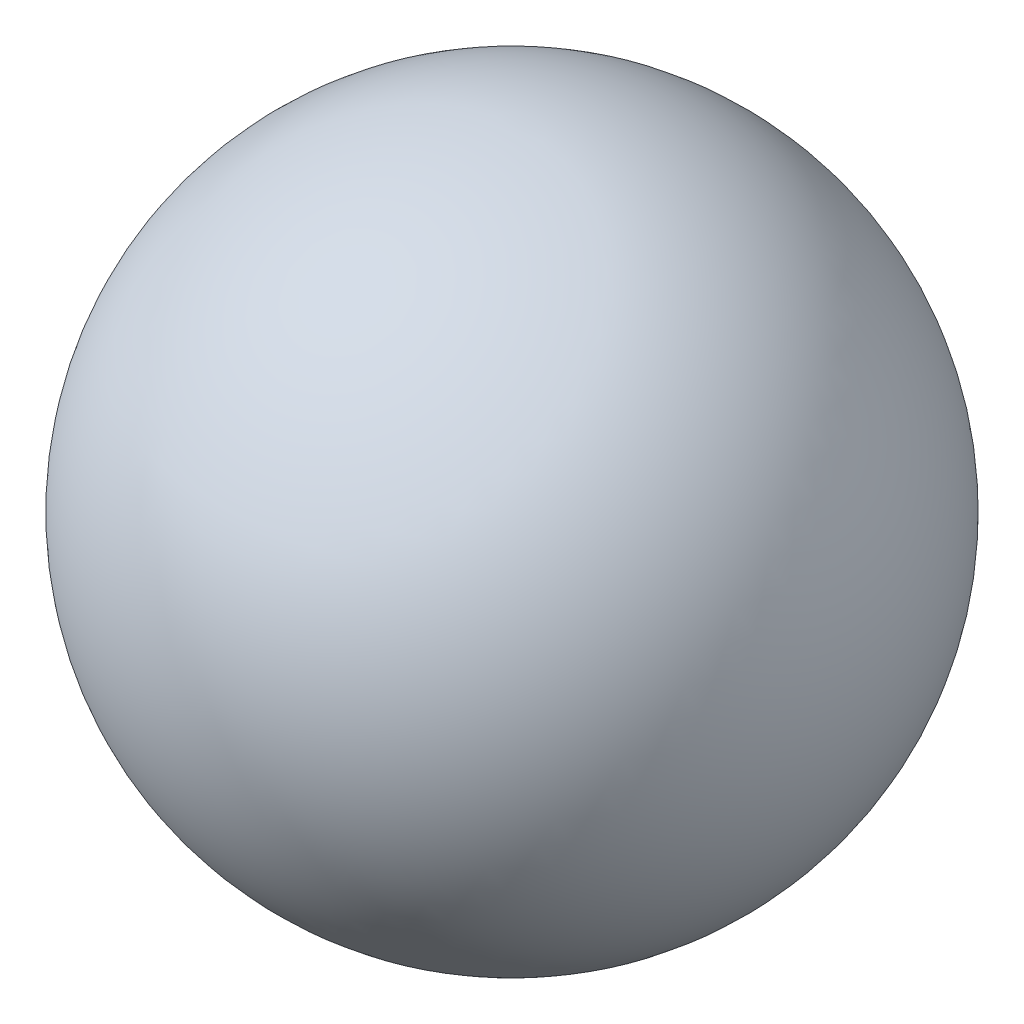
ISO-10303-21;
HEADER;
FILE_DESCRIPTION(('STEP AP214'),'2;1');
FILE_NAME('part.step','',(''),(''),'','','');
FILE_SCHEMA(('AUTOMOTIVE_DESIGN { 1 0 10303 214 1 1 1 1 }'));
ENDSEC;
DATA;
#1=APPLICATION_CONTEXT('core data for automotive mechanical design processes');
#2=APPLICATION_PROTOCOL_DEFINITION('international standard','automotive_design',2000,#1);
#3=PRODUCT_CONTEXT('',#1,'mechanical');
#4=PRODUCT('Part','Part','',(#3));
#5=PRODUCT_RELATED_PRODUCT_CATEGORY('part','',(#4));
#6=PRODUCT_DEFINITION_FORMATION('','',#4);
#7=PRODUCT_DEFINITION_CONTEXT('part definition',#1,'design');
#8=PRODUCT_DEFINITION('design','',#6,#7);
#9=PRODUCT_DEFINITION_SHAPE('','',#8);
#10=(LENGTH_UNIT() NAMED_UNIT(*) SI_UNIT(.MILLI.,.METRE.));
#11=(NAMED_UNIT(*) PLANE_ANGLE_UNIT() SI_UNIT($,.RADIAN.));
#12=(NAMED_UNIT(*) SI_UNIT($,.STERADIAN.) SOLID_ANGLE_UNIT());
#13=UNCERTAINTY_MEASURE_WITH_UNIT(LENGTH_MEASURE(1.E-05),#10,'distance_accuracy_value','');
#14=(GEOMETRIC_REPRESENTATION_CONTEXT(3) GLOBAL_UNCERTAINTY_ASSIGNED_CONTEXT((#13)) GLOBAL_UNIT_ASSIGNED_CONTEXT((#10,
#11,#12)) REPRESENTATION_CONTEXT('',''));
#15=CARTESIAN_POINT('',(0.,0.,0.));
#16=DIRECTION('',(0.,0.,1.));
#17=DIRECTION('',(1.,0.,0.));
#18=AXIS2_PLACEMENT_3D('',#15,#16,#17);
#19=CARTESIAN_POINT('',(0.,21.38,0.));
#20=DIRECTION('',(0.,-1.,0.));
#21=DIRECTION('',(-1.,0.,0.));
#22=AXIS2_PLACEMENT_3D('',#19,#20,#21);
#23=SPHERICAL_SURFACE('',#22,21.38);
#24=CARTESIAN_POINT('',(0.,0.,0.));
#25=VERTEX_POINT('',#24);
#26=VERTEX_LOOP('',#25);
#27=FACE_BOUND('',#26,.T.);
#28=ADVANCED_FACE('F32',(#27),#23,.T.);
#29=CLOSED_SHELL('',(#28));
#30=MANIFOLD_SOLID_BREP('B2',#29);
#31=ADVANCED_BREP_SHAPE_REPRESENTATION('',(#18,#30),#14);
#32=SHAPE_DEFINITION_REPRESENTATION(#9,#31);
ENDSEC;
END-ISO-10303-21;
